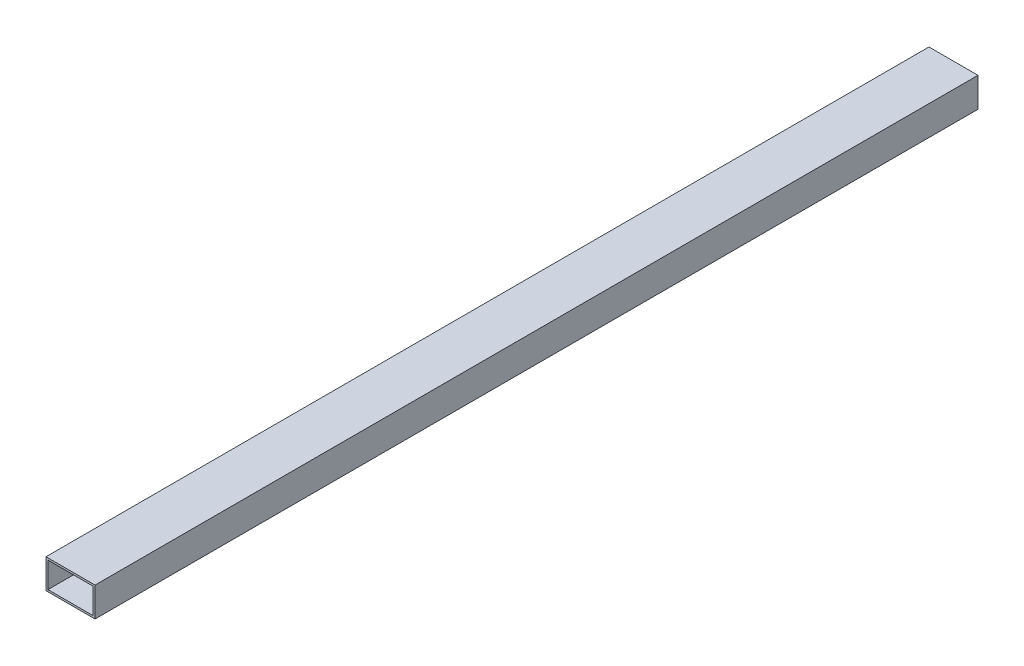
ISO-10303-21;
HEADER;
FILE_DESCRIPTION(('STEP AP214'),'2;1');
FILE_NAME('part.step','',(''),(''),'','','');
FILE_SCHEMA(('AUTOMOTIVE_DESIGN { 1 0 10303 214 1 1 1 1 }'));
ENDSEC;
DATA;
#1=APPLICATION_CONTEXT('core data for automotive mechanical design processes');
#2=APPLICATION_PROTOCOL_DEFINITION('international standard','automotive_design',2000,#1);
#3=PRODUCT_CONTEXT('',#1,'mechanical');
#4=PRODUCT('Part','Part','',(#3));
#5=PRODUCT_RELATED_PRODUCT_CATEGORY('part','',(#4));
#6=PRODUCT_DEFINITION_FORMATION('','',#4);
#7=PRODUCT_DEFINITION_CONTEXT('part definition',#1,'design');
#8=PRODUCT_DEFINITION('design','',#6,#7);
#9=PRODUCT_DEFINITION_SHAPE('','',#8);
#10=(LENGTH_UNIT() NAMED_UNIT(*) SI_UNIT(.MILLI.,.METRE.));
#11=(NAMED_UNIT(*) PLANE_ANGLE_UNIT() SI_UNIT($,.RADIAN.));
#12=(NAMED_UNIT(*) SI_UNIT($,.STERADIAN.) SOLID_ANGLE_UNIT());
#13=UNCERTAINTY_MEASURE_WITH_UNIT(LENGTH_MEASURE(1.E-05),#10,'distance_accuracy_value','');
#14=(GEOMETRIC_REPRESENTATION_CONTEXT(3) GLOBAL_UNCERTAINTY_ASSIGNED_CONTEXT((#13)) GLOBAL_UNIT_ASSIGNED_CONTEXT((#10,
#11,#12)) REPRESENTATION_CONTEXT('',''));
#15=CARTESIAN_POINT('',(0.,0.,0.));
#16=DIRECTION('',(0.,0.,1.));
#17=DIRECTION('',(1.,0.,0.));
#18=AXIS2_PLACEMENT_3D('',#15,#16,#17);
#19=CARTESIAN_POINT('',(0.,0.,450.));
#20=DIRECTION('',(0.,0.,1.));
#21=DIRECTION('',(1.,0.,0.));
#22=AXIS2_PLACEMENT_3D('',#19,#20,#21);
#23=PLANE('',#22);
#24=DIRECTION('',(0.,-1.,0.));
#25=VECTOR('',#24,1.);
#26=CARTESIAN_POINT('',(-25.,-15.,450.));
#27=LINE('',#26,#25);
#28=CARTESIAN_POINT('',(-25.,15.,450.));
#29=VERTEX_POINT('',#28);
#30=CARTESIAN_POINT('',(-25.,-15.,450.));
#31=VERTEX_POINT('',#30);
#32=EDGE_CURVE('E157',#29,#31,#27,.T.);
#33=ORIENTED_EDGE('',*,*,#32,.T.);
#34=DIRECTION('',(1.,0.,0.));
#35=VECTOR('',#34,1.);
#36=CARTESIAN_POINT('',(25.,-15.,450.));
#37=LINE('',#36,#35);
#38=CARTESIAN_POINT('',(25.,-15.,450.));
#39=VERTEX_POINT('',#38);
#40=EDGE_CURVE('E161',#31,#39,#37,.T.);
#41=ORIENTED_EDGE('',*,*,#40,.T.);
#42=DIRECTION('',(0.,1.,0.));
#43=VECTOR('',#42,1.);
#44=CARTESIAN_POINT('',(25.,-15.,450.));
#45=LINE('',#44,#43);
#46=CARTESIAN_POINT('',(25.,15.,450.));
#47=VERTEX_POINT('',#46);
#48=EDGE_CURVE('E165',#39,#47,#45,.T.);
#49=ORIENTED_EDGE('',*,*,#48,.T.);
#50=DIRECTION('',(-1.,0.,0.));
#51=VECTOR('',#50,1.);
#52=CARTESIAN_POINT('',(25.,15.,450.));
#53=LINE('',#52,#51);
#54=EDGE_CURVE('E168',#47,#29,#53,.T.);
#55=ORIENTED_EDGE('',*,*,#54,.T.);
#56=EDGE_LOOP('',(#33,#41,#49,#55));
#57=FACE_BOUND('',#56,.T.);
#58=DIRECTION('',(-1.,0.,0.));
#59=VECTOR('',#58,1.);
#60=CARTESIAN_POINT('',(23.,13.,450.));
#61=LINE('',#60,#59);
#62=CARTESIAN_POINT('',(23.,13.,450.));
#63=VERTEX_POINT('',#62);
#64=CARTESIAN_POINT('',(-23.,13.,450.));
#65=VERTEX_POINT('',#64);
#66=EDGE_CURVE('E118',#63,#65,#61,.T.);
#67=ORIENTED_EDGE('',*,*,#66,.F.);
#68=DIRECTION('',(0.,1.,0.));
#69=VECTOR('',#68,1.);
#70=CARTESIAN_POINT('',(23.,-13.,450.));
#71=LINE('',#70,#69);
#72=CARTESIAN_POINT('',(23.,-13.,450.));
#73=VERTEX_POINT('',#72);
#74=EDGE_CURVE('E109',#73,#63,#71,.T.);
#75=ORIENTED_EDGE('',*,*,#74,.F.);
#76=DIRECTION('',(1.,0.,0.));
#77=VECTOR('',#76,1.);
#78=CARTESIAN_POINT('',(23.,-13.,450.));
#79=LINE('',#78,#77);
#80=CARTESIAN_POINT('',(-23.,-13.,450.));
#81=VERTEX_POINT('',#80);
#82=EDGE_CURVE('E135',#81,#73,#79,.T.);
#83=ORIENTED_EDGE('',*,*,#82,.F.);
#84=DIRECTION('',(0.,-1.,0.));
#85=VECTOR('',#84,1.);
#86=CARTESIAN_POINT('',(-23.,-13.,450.));
#87=LINE('',#86,#85);
#88=EDGE_CURVE('E131',#65,#81,#87,.T.);
#89=ORIENTED_EDGE('',*,*,#88,.F.);
#90=EDGE_LOOP('',(#67,#75,#83,#89));
#91=FACE_BOUND('',#90,.T.);
#92=ADVANCED_FACE('F43',(#57,#91),#23,.T.);
#93=CARTESIAN_POINT('',(0.,0.,-450.));
#94=DIRECTION('',(0.,0.,1.));
#95=DIRECTION('',(1.,0.,0.));
#96=AXIS2_PLACEMENT_3D('',#93,#94,#95);
#97=PLANE('',#96);
#98=DIRECTION('',(0.,-1.,0.));
#99=VECTOR('',#98,1.);
#100=CARTESIAN_POINT('',(-25.,-15.,-450.));
#101=LINE('',#100,#99);
#102=CARTESIAN_POINT('',(-25.,15.,-450.));
#103=VERTEX_POINT('',#102);
#104=CARTESIAN_POINT('',(-25.,-15.,-450.));
#105=VERTEX_POINT('',#104);
#106=EDGE_CURVE('E127',#103,#105,#101,.T.);
#107=ORIENTED_EDGE('',*,*,#106,.F.);
#108=DIRECTION('',(-1.,0.,0.));
#109=VECTOR('',#108,1.);
#110=CARTESIAN_POINT('',(25.,15.,-450.));
#111=LINE('',#110,#109);
#112=CARTESIAN_POINT('',(25.,15.,-450.));
#113=VERTEX_POINT('',#112);
#114=EDGE_CURVE('E162',#113,#103,#111,.T.);
#115=ORIENTED_EDGE('',*,*,#114,.F.);
#116=DIRECTION('',(0.,1.,0.));
#117=VECTOR('',#116,1.);
#118=CARTESIAN_POINT('',(25.,-15.,-450.));
#119=LINE('',#118,#117);
#120=CARTESIAN_POINT('',(25.,-15.,-450.));
#121=VERTEX_POINT('',#120);
#122=EDGE_CURVE('E178',#121,#113,#119,.T.);
#123=ORIENTED_EDGE('',*,*,#122,.F.);
#124=DIRECTION('',(1.,0.,0.));
#125=VECTOR('',#124,1.);
#126=CARTESIAN_POINT('',(25.,-15.,-450.));
#127=LINE('',#126,#125);
#128=EDGE_CURVE('E175',#105,#121,#127,.T.);
#129=ORIENTED_EDGE('',*,*,#128,.F.);
#130=EDGE_LOOP('',(#107,#115,#123,#129));
#131=FACE_BOUND('',#130,.T.);
#132=DIRECTION('',(0.,1.,0.));
#133=VECTOR('',#132,1.);
#134=CARTESIAN_POINT('',(23.,-13.,-450.));
#135=LINE('',#134,#133);
#136=CARTESIAN_POINT('',(23.,-13.,-450.));
#137=VERTEX_POINT('',#136);
#138=CARTESIAN_POINT('',(23.,13.,-450.));
#139=VERTEX_POINT('',#138);
#140=EDGE_CURVE('E67',#137,#139,#135,.T.);
#141=ORIENTED_EDGE('',*,*,#140,.T.);
#142=DIRECTION('',(-1.,0.,0.));
#143=VECTOR('',#142,1.);
#144=CARTESIAN_POINT('',(23.,13.,-450.));
#145=LINE('',#144,#143);
#146=CARTESIAN_POINT('',(-23.,13.,-450.));
#147=VERTEX_POINT('',#146);
#148=EDGE_CURVE('E125',#139,#147,#145,.T.);
#149=ORIENTED_EDGE('',*,*,#148,.T.);
#150=DIRECTION('',(0.,-1.,0.));
#151=VECTOR('',#150,1.);
#152=CARTESIAN_POINT('',(-23.,-13.,-450.));
#153=LINE('',#152,#151);
#154=CARTESIAN_POINT('',(-23.,-13.,-450.));
#155=VERTEX_POINT('',#154);
#156=EDGE_CURVE('E144',#147,#155,#153,.T.);
#157=ORIENTED_EDGE('',*,*,#156,.T.);
#158=DIRECTION('',(1.,0.,0.));
#159=VECTOR('',#158,1.);
#160=CARTESIAN_POINT('',(23.,-13.,-450.));
#161=LINE('',#160,#159);
#162=EDGE_CURVE('E119',#155,#137,#161,.T.);
#163=ORIENTED_EDGE('',*,*,#162,.T.);
#164=EDGE_LOOP('',(#141,#149,#157,#163));
#165=FACE_BOUND('',#164,.T.);
#166=ADVANCED_FACE('F201',(#131,#165),#97,.F.);
#167=CARTESIAN_POINT('',(-25.,-15.,450.));
#168=DIRECTION('',(1.,0.,0.));
#169=DIRECTION('',(0.,1.,0.));
#170=AXIS2_PLACEMENT_3D('',#167,#168,#169);
#171=PLANE('',#170);
#172=ORIENTED_EDGE('',*,*,#106,.T.);
#173=DIRECTION('',(0.,0.,-1.));
#174=VECTOR('',#173,1.);
#175=CARTESIAN_POINT('',(-25.,-15.,450.));
#176=LINE('',#175,#174);
#177=EDGE_CURVE('E11',#31,#105,#176,.T.);
#178=ORIENTED_EDGE('',*,*,#177,.F.);
#179=ORIENTED_EDGE('',*,*,#32,.F.);
#180=DIRECTION('',(0.,0.,-1.));
#181=VECTOR('',#180,1.);
#182=CARTESIAN_POINT('',(-25.,15.,450.));
#183=LINE('',#182,#181);
#184=EDGE_CURVE('E171',#29,#103,#183,.T.);
#185=ORIENTED_EDGE('',*,*,#184,.T.);
#186=EDGE_LOOP('',(#172,#178,#179,#185));
#187=FACE_BOUND('',#186,.T.);
#188=ADVANCED_FACE('F45',(#187),#171,.F.);
#189=CARTESIAN_POINT('',(25.,-15.,450.));
#190=DIRECTION('',(0.,1.,0.));
#191=DIRECTION('',(-1.,0.,0.));
#192=AXIS2_PLACEMENT_3D('',#189,#190,#191);
#193=PLANE('',#192);
#194=ORIENTED_EDGE('',*,*,#128,.T.);
#195=DIRECTION('',(0.,0.,-1.));
#196=VECTOR('',#195,1.);
#197=CARTESIAN_POINT('',(25.,-15.,450.));
#198=LINE('',#197,#196);
#199=EDGE_CURVE('E52',#39,#121,#198,.T.);
#200=ORIENTED_EDGE('',*,*,#199,.F.);
#201=ORIENTED_EDGE('',*,*,#40,.F.);
#202=ORIENTED_EDGE('',*,*,#177,.T.);
#203=EDGE_LOOP('',(#194,#200,#201,#202));
#204=FACE_BOUND('',#203,.T.);
#205=ADVANCED_FACE('F211',(#204),#193,.F.);
#206=CARTESIAN_POINT('',(25.,-15.,450.));
#207=DIRECTION('',(-1.,0.,0.));
#208=DIRECTION('',(0.,0.,1.));
#209=AXIS2_PLACEMENT_3D('',#206,#207,#208);
#210=PLANE('',#209);
#211=ORIENTED_EDGE('',*,*,#122,.T.);
#212=DIRECTION('',(0.,0.,-1.));
#213=VECTOR('',#212,1.);
#214=CARTESIAN_POINT('',(25.,15.,450.));
#215=LINE('',#214,#213);
#216=EDGE_CURVE('E186',#47,#113,#215,.T.);
#217=ORIENTED_EDGE('',*,*,#216,.F.);
#218=ORIENTED_EDGE('',*,*,#48,.F.);
#219=ORIENTED_EDGE('',*,*,#199,.T.);
#220=EDGE_LOOP('',(#211,#217,#218,#219));
#221=FACE_BOUND('',#220,.T.);
#222=ADVANCED_FACE('F195',(#221),#210,.F.);
#223=CARTESIAN_POINT('',(25.,15.,450.));
#224=DIRECTION('',(0.,-1.,0.));
#225=DIRECTION('',(1.,0.,0.));
#226=AXIS2_PLACEMENT_3D('',#223,#224,#225);
#227=PLANE('',#226);
#228=ORIENTED_EDGE('',*,*,#114,.T.);
#229=ORIENTED_EDGE('',*,*,#184,.F.);
#230=ORIENTED_EDGE('',*,*,#54,.F.);
#231=ORIENTED_EDGE('',*,*,#216,.T.);
#232=EDGE_LOOP('',(#228,#229,#230,#231));
#233=FACE_BOUND('',#232,.T.);
#234=ADVANCED_FACE('F205',(#233),#227,.F.);
#235=CARTESIAN_POINT('',(23.,-13.,450.));
#236=DIRECTION('',(-1.,0.,0.));
#237=DIRECTION('',(0.,0.,1.));
#238=AXIS2_PLACEMENT_3D('',#235,#236,#237);
#239=PLANE('',#238);
#240=ORIENTED_EDGE('',*,*,#140,.F.);
#241=DIRECTION('',(0.,0.,-1.));
#242=VECTOR('',#241,1.);
#243=CARTESIAN_POINT('',(23.,-13.,450.));
#244=LINE('',#243,#242);
#245=EDGE_CURVE('E113',#73,#137,#244,.T.);
#246=ORIENTED_EDGE('',*,*,#245,.F.);
#247=ORIENTED_EDGE('',*,*,#74,.T.);
#248=DIRECTION('',(0.,0.,-1.));
#249=VECTOR('',#248,1.);
#250=CARTESIAN_POINT('',(23.,13.,450.));
#251=LINE('',#250,#249);
#252=EDGE_CURVE('E112',#63,#139,#251,.T.);
#253=ORIENTED_EDGE('',*,*,#252,.T.);
#254=EDGE_LOOP('',(#240,#246,#247,#253));
#255=FACE_BOUND('',#254,.T.);
#256=ADVANCED_FACE('F111',(#255),#239,.T.);
#257=CARTESIAN_POINT('',(23.,13.,450.));
#258=DIRECTION('',(0.,-1.,0.));
#259=DIRECTION('',(1.,0.,0.));
#260=AXIS2_PLACEMENT_3D('',#257,#258,#259);
#261=PLANE('',#260);
#262=ORIENTED_EDGE('',*,*,#148,.F.);
#263=ORIENTED_EDGE('',*,*,#252,.F.);
#264=ORIENTED_EDGE('',*,*,#66,.T.);
#265=DIRECTION('',(0.,0.,-1.));
#266=VECTOR('',#265,1.);
#267=CARTESIAN_POINT('',(-23.,13.,450.));
#268=LINE('',#267,#266);
#269=EDGE_CURVE('E128',#65,#147,#268,.T.);
#270=ORIENTED_EDGE('',*,*,#269,.T.);
#271=EDGE_LOOP('',(#262,#263,#264,#270));
#272=FACE_BOUND('',#271,.T.);
#273=ADVANCED_FACE('F122',(#272),#261,.T.);
#274=CARTESIAN_POINT('',(-23.,-13.,450.));
#275=DIRECTION('',(1.,0.,0.));
#276=DIRECTION('',(0.,0.,-1.));
#277=AXIS2_PLACEMENT_3D('',#274,#275,#276);
#278=PLANE('',#277);
#279=ORIENTED_EDGE('',*,*,#156,.F.);
#280=ORIENTED_EDGE('',*,*,#269,.F.);
#281=ORIENTED_EDGE('',*,*,#88,.T.);
#282=DIRECTION('',(0.,0.,-1.));
#283=VECTOR('',#282,1.);
#284=CARTESIAN_POINT('',(-23.,-13.,450.));
#285=LINE('',#284,#283);
#286=EDGE_CURVE('E59',#81,#155,#285,.T.);
#287=ORIENTED_EDGE('',*,*,#286,.T.);
#288=EDGE_LOOP('',(#279,#280,#281,#287));
#289=FACE_BOUND('',#288,.T.);
#290=ADVANCED_FACE('F234',(#289),#278,.T.);
#291=CARTESIAN_POINT('',(23.,-13.,450.));
#292=DIRECTION('',(0.,1.,0.));
#293=DIRECTION('',(0.,0.,1.));
#294=AXIS2_PLACEMENT_3D('',#291,#292,#293);
#295=PLANE('',#294);
#296=ORIENTED_EDGE('',*,*,#162,.F.);
#297=ORIENTED_EDGE('',*,*,#286,.F.);
#298=ORIENTED_EDGE('',*,*,#82,.T.);
#299=ORIENTED_EDGE('',*,*,#245,.T.);
#300=EDGE_LOOP('',(#296,#297,#298,#299));
#301=FACE_BOUND('',#300,.T.);
#302=ADVANCED_FACE('F238',(#301),#295,.T.);
#303=CLOSED_SHELL('',(#92,#166,#188,#205,#222,#234,#256,#273,#290,#302));
#304=MANIFOLD_SOLID_BREP('B2',#303);
#305=ADVANCED_BREP_SHAPE_REPRESENTATION('',(#18,#304),#14);
#306=SHAPE_DEFINITION_REPRESENTATION(#9,#305);
ENDSEC;
END-ISO-10303-21;
